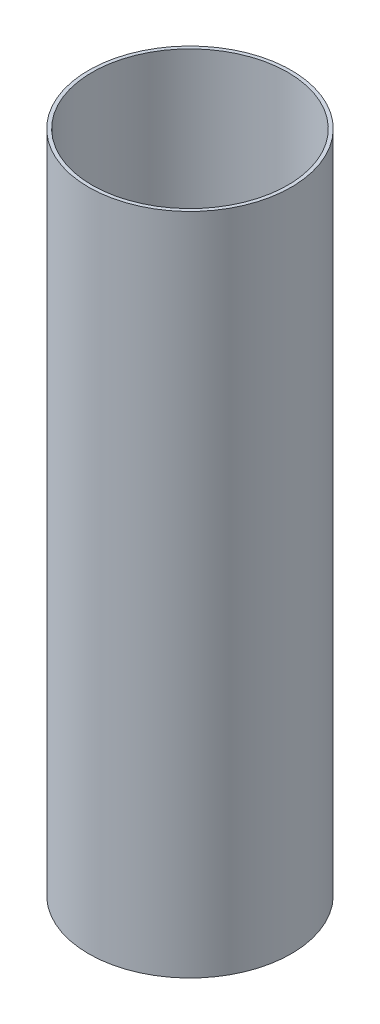
ISO-10303-21;
HEADER;
FILE_DESCRIPTION(('STEP AP214'),'2;1');
FILE_NAME('part.step','',(''),(''),'','','');
FILE_SCHEMA(('AUTOMOTIVE_DESIGN { 1 0 10303 214 1 1 1 1 }'));
ENDSEC;
DATA;
#1=APPLICATION_CONTEXT('core data for automotive mechanical design processes');
#2=APPLICATION_PROTOCOL_DEFINITION('international standard','automotive_design',2000,#1);
#3=PRODUCT_CONTEXT('',#1,'mechanical');
#4=PRODUCT('Part','Part','',(#3));
#5=PRODUCT_RELATED_PRODUCT_CATEGORY('part','',(#4));
#6=PRODUCT_DEFINITION_FORMATION('','',#4);
#7=PRODUCT_DEFINITION_CONTEXT('part definition',#1,'design');
#8=PRODUCT_DEFINITION('design','',#6,#7);
#9=PRODUCT_DEFINITION_SHAPE('','',#8);
#10=(LENGTH_UNIT() NAMED_UNIT(*) SI_UNIT(.MILLI.,.METRE.));
#11=(NAMED_UNIT(*) PLANE_ANGLE_UNIT() SI_UNIT($,.RADIAN.));
#12=(NAMED_UNIT(*) SI_UNIT($,.STERADIAN.) SOLID_ANGLE_UNIT());
#13=UNCERTAINTY_MEASURE_WITH_UNIT(LENGTH_MEASURE(1.E-05),#10,'distance_accuracy_value','');
#14=(GEOMETRIC_REPRESENTATION_CONTEXT(3) GLOBAL_UNCERTAINTY_ASSIGNED_CONTEXT((#13)) GLOBAL_UNIT_ASSIGNED_CONTEXT((#10,
#11,#12)) REPRESENTATION_CONTEXT('',''));
#15=CARTESIAN_POINT('',(0.,0.,0.));
#16=DIRECTION('',(0.,0.,1.));
#17=DIRECTION('',(1.,0.,0.));
#18=AXIS2_PLACEMENT_3D('',#15,#16,#17);
#19=CARTESIAN_POINT('',(0.,301.625,0.));
#20=DIRECTION('',(0.,1.,0.));
#21=DIRECTION('',(0.,0.,1.));
#22=AXIS2_PLACEMENT_3D('',#19,#20,#21);
#23=PLANE('',#22);
#24=CARTESIAN_POINT('',(0.,301.625,0.));
#25=DIRECTION('',(0.,1.,0.));
#26=DIRECTION('',(0.,0.,1.));
#27=AXIS2_PLACEMENT_3D('',#24,#25,#26);
#28=CIRCLE('',#27,92.075);
#29=CARTESIAN_POINT('',(0.,301.625,92.075));
#30=VERTEX_POINT('',#29);
#31=EDGE_CURVE('E10',#30,#30,#28,.T.);
#32=ORIENTED_EDGE('',*,*,#31,.T.);
#33=EDGE_LOOP('',(#32));
#34=FACE_BOUND('',#33,.T.);
#35=CARTESIAN_POINT('',(0.,301.625,0.));
#36=DIRECTION('',(0.,1.,0.));
#37=DIRECTION('',(0.,0.,1.));
#38=AXIS2_PLACEMENT_3D('',#35,#36,#37);
#39=CIRCLE('',#38,88.9);
#40=CARTESIAN_POINT('',(0.,301.625,88.9));
#41=VERTEX_POINT('',#40);
#42=EDGE_CURVE('E52',#41,#41,#39,.T.);
#43=ORIENTED_EDGE('',*,*,#42,.F.);
#44=EDGE_LOOP('',(#43));
#45=FACE_BOUND('',#44,.T.);
#46=ADVANCED_FACE('F41',(#34,#45),#23,.T.);
#47=CARTESIAN_POINT('',(0.,-301.625,0.));
#48=DIRECTION('',(0.,1.,0.));
#49=DIRECTION('',(0.,0.,1.));
#50=AXIS2_PLACEMENT_3D('',#47,#48,#49);
#51=PLANE('',#50);
#52=CARTESIAN_POINT('',(0.,-301.625,0.));
#53=DIRECTION('',(0.,1.,0.));
#54=DIRECTION('',(0.,0.,1.));
#55=AXIS2_PLACEMENT_3D('',#52,#53,#54);
#56=CIRCLE('',#55,92.075);
#57=CARTESIAN_POINT('',(0.,-301.625,92.075));
#58=VERTEX_POINT('',#57);
#59=EDGE_CURVE('E45',#58,#58,#56,.T.);
#60=ORIENTED_EDGE('',*,*,#59,.F.);
#61=EDGE_LOOP('',(#60));
#62=FACE_BOUND('',#61,.T.);
#63=CARTESIAN_POINT('',(0.,-301.625,0.));
#64=DIRECTION('',(0.,1.,0.));
#65=DIRECTION('',(0.,0.,1.));
#66=AXIS2_PLACEMENT_3D('',#63,#64,#65);
#67=CIRCLE('',#66,88.9);
#68=CARTESIAN_POINT('',(0.,-301.625,88.9));
#69=VERTEX_POINT('',#68);
#70=EDGE_CURVE('E54',#69,#69,#67,.T.);
#71=ORIENTED_EDGE('',*,*,#70,.T.);
#72=EDGE_LOOP('',(#71));
#73=FACE_BOUND('',#72,.T.);
#74=ADVANCED_FACE('F64',(#62,#73),#51,.F.);
#75=CARTESIAN_POINT('',(0.,301.625,0.));
#76=DIRECTION('',(0.,-1.,0.));
#77=DIRECTION('',(0.,0.,-1.));
#78=AXIS2_PLACEMENT_3D('',#75,#76,#77);
#79=CYLINDRICAL_SURFACE('',#78,92.075);
#80=ORIENTED_EDGE('',*,*,#31,.F.);
#81=EDGE_LOOP('',(#80));
#82=FACE_BOUND('',#81,.T.);
#83=ORIENTED_EDGE('',*,*,#59,.T.);
#84=EDGE_LOOP('',(#83));
#85=FACE_BOUND('',#84,.T.);
#86=ADVANCED_FACE('F43',(#82,#85),#79,.T.);
#87=CARTESIAN_POINT('',(0.,301.625,0.));
#88=DIRECTION('',(0.,-1.,0.));
#89=DIRECTION('',(0.,0.,-1.));
#90=AXIS2_PLACEMENT_3D('',#87,#88,#89);
#91=CYLINDRICAL_SURFACE('',#90,88.9);
#92=ORIENTED_EDGE('',*,*,#42,.T.);
#93=EDGE_LOOP('',(#92));
#94=FACE_BOUND('',#93,.T.);
#95=ORIENTED_EDGE('',*,*,#70,.F.);
#96=EDGE_LOOP('',(#95));
#97=FACE_BOUND('',#96,.T.);
#98=ADVANCED_FACE('F60',(#94,#97),#91,.F.);
#99=CLOSED_SHELL('',(#46,#74,#86,#98));
#100=MANIFOLD_SOLID_BREP('B2',#99);
#101=ADVANCED_BREP_SHAPE_REPRESENTATION('',(#18,#100),#14);
#102=SHAPE_DEFINITION_REPRESENTATION(#9,#101);
ENDSEC;
END-ISO-10303-21;
